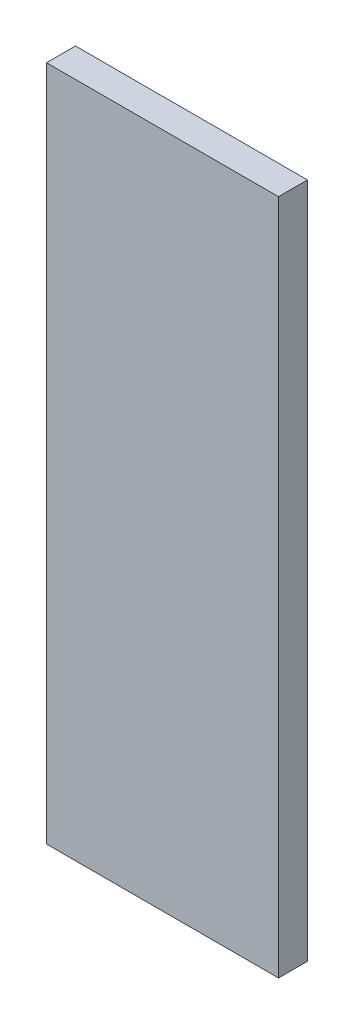
ISO-10303-21;
HEADER;
FILE_DESCRIPTION(('STEP AP214'),'2;1');
FILE_NAME('part.step','',(''),(''),'','','');
FILE_SCHEMA(('AUTOMOTIVE_DESIGN { 1 0 10303 214 1 1 1 1 }'));
ENDSEC;
DATA;
#1=APPLICATION_CONTEXT('core data for automotive mechanical design processes');
#2=APPLICATION_PROTOCOL_DEFINITION('international standard','automotive_design',2000,#1);
#3=PRODUCT_CONTEXT('',#1,'mechanical');
#4=PRODUCT('Part','Part','',(#3));
#5=PRODUCT_RELATED_PRODUCT_CATEGORY('part','',(#4));
#6=PRODUCT_DEFINITION_FORMATION('','',#4);
#7=PRODUCT_DEFINITION_CONTEXT('part definition',#1,'design');
#8=PRODUCT_DEFINITION('design','',#6,#7);
#9=PRODUCT_DEFINITION_SHAPE('','',#8);
#10=(LENGTH_UNIT() NAMED_UNIT(*) SI_UNIT(.MILLI.,.METRE.));
#11=(NAMED_UNIT(*) PLANE_ANGLE_UNIT() SI_UNIT($,.RADIAN.));
#12=(NAMED_UNIT(*) SI_UNIT($,.STERADIAN.) SOLID_ANGLE_UNIT());
#13=UNCERTAINTY_MEASURE_WITH_UNIT(LENGTH_MEASURE(1.E-05),#10,'distance_accuracy_value','');
#14=(GEOMETRIC_REPRESENTATION_CONTEXT(3) GLOBAL_UNCERTAINTY_ASSIGNED_CONTEXT((#13)) GLOBAL_UNIT_ASSIGNED_CONTEXT((#10,
#11,#12)) REPRESENTATION_CONTEXT('',''));
#15=CARTESIAN_POINT('',(0.,0.,0.));
#16=DIRECTION('',(0.,0.,1.));
#17=DIRECTION('',(1.,0.,0.));
#18=AXIS2_PLACEMENT_3D('',#15,#16,#17);
#19=CARTESIAN_POINT('',(12.,35.,3.));
#20=DIRECTION('',(-1.,0.,0.));
#21=DIRECTION('',(0.,-1.,0.));
#22=AXIS2_PLACEMENT_3D('',#19,#20,#21);
#23=PLANE('',#22);
#24=DIRECTION('',(0.,1.,0.));
#25=VECTOR('',#24,1.);
#26=CARTESIAN_POINT('',(12.,35.,0.));
#27=LINE('',#26,#25);
#28=CARTESIAN_POINT('',(12.,-35.,0.));
#29=VERTEX_POINT('',#28);
#30=CARTESIAN_POINT('',(12.,35.,0.));
#31=VERTEX_POINT('',#30);
#32=EDGE_CURVE('E108',#29,#31,#27,.T.);
#33=ORIENTED_EDGE('',*,*,#32,.T.);
#34=DIRECTION('',(0.,0.,-1.));
#35=VECTOR('',#34,1.);
#36=CARTESIAN_POINT('',(12.,35.,3.));
#37=LINE('',#36,#35);
#38=CARTESIAN_POINT('',(12.,35.,3.));
#39=VERTEX_POINT('',#38);
#40=EDGE_CURVE('E11',#39,#31,#37,.T.);
#41=ORIENTED_EDGE('',*,*,#40,.F.);
#42=DIRECTION('',(0.,1.,0.));
#43=VECTOR('',#42,1.);
#44=CARTESIAN_POINT('',(12.,35.,3.));
#45=LINE('',#44,#43);
#46=CARTESIAN_POINT('',(12.,-35.,3.));
#47=VERTEX_POINT('',#46);
#48=EDGE_CURVE('E96',#47,#39,#45,.T.);
#49=ORIENTED_EDGE('',*,*,#48,.F.);
#50=DIRECTION('',(0.,0.,-1.));
#51=VECTOR('',#50,1.);
#52=CARTESIAN_POINT('',(12.,-35.,3.));
#53=LINE('',#52,#51);
#54=EDGE_CURVE('E104',#47,#29,#53,.T.);
#55=ORIENTED_EDGE('',*,*,#54,.T.);
#56=EDGE_LOOP('',(#33,#41,#49,#55));
#57=FACE_BOUND('',#56,.T.);
#58=ADVANCED_FACE('F45',(#57),#23,.F.);
#59=CARTESIAN_POINT('',(-12.,35.,3.));
#60=DIRECTION('',(0.,-1.,0.));
#61=DIRECTION('',(0.,0.,-1.));
#62=AXIS2_PLACEMENT_3D('',#59,#60,#61);
#63=PLANE('',#62);
#64=DIRECTION('',(-1.,0.,0.));
#65=VECTOR('',#64,1.);
#66=CARTESIAN_POINT('',(-12.,35.,0.));
#67=LINE('',#66,#65);
#68=CARTESIAN_POINT('',(-12.,35.,0.));
#69=VERTEX_POINT('',#68);
#70=EDGE_CURVE('E100',#31,#69,#67,.T.);
#71=ORIENTED_EDGE('',*,*,#70,.T.);
#72=DIRECTION('',(0.,0.,-1.));
#73=VECTOR('',#72,1.);
#74=CARTESIAN_POINT('',(-12.,35.,3.));
#75=LINE('',#74,#73);
#76=CARTESIAN_POINT('',(-12.,35.,3.));
#77=VERTEX_POINT('',#76);
#78=EDGE_CURVE('E53',#77,#69,#75,.T.);
#79=ORIENTED_EDGE('',*,*,#78,.F.);
#80=DIRECTION('',(-1.,0.,0.));
#81=VECTOR('',#80,1.);
#82=CARTESIAN_POINT('',(-12.,35.,3.));
#83=LINE('',#82,#81);
#84=EDGE_CURVE('E91',#39,#77,#83,.T.);
#85=ORIENTED_EDGE('',*,*,#84,.F.);
#86=ORIENTED_EDGE('',*,*,#40,.T.);
#87=EDGE_LOOP('',(#71,#79,#85,#86));
#88=FACE_BOUND('',#87,.T.);
#89=ADVANCED_FACE('F99',(#88),#63,.F.);
#90=CARTESIAN_POINT('',(-12.,35.,3.));
#91=DIRECTION('',(1.,0.,0.));
#92=DIRECTION('',(0.,1.,0.));
#93=AXIS2_PLACEMENT_3D('',#90,#91,#92);
#94=PLANE('',#93);
#95=DIRECTION('',(0.,-1.,0.));
#96=VECTOR('',#95,1.);
#97=CARTESIAN_POINT('',(-12.,35.,0.));
#98=LINE('',#97,#96);
#99=CARTESIAN_POINT('',(-12.,-35.,0.));
#100=VERTEX_POINT('',#99);
#101=EDGE_CURVE('E78',#69,#100,#98,.T.);
#102=ORIENTED_EDGE('',*,*,#101,.T.);
#103=DIRECTION('',(0.,0.,-1.));
#104=VECTOR('',#103,1.);
#105=CARTESIAN_POINT('',(-12.,-35.,3.));
#106=LINE('',#105,#104);
#107=CARTESIAN_POINT('',(-12.,-35.,3.));
#108=VERTEX_POINT('',#107);
#109=EDGE_CURVE('E101',#108,#100,#106,.T.);
#110=ORIENTED_EDGE('',*,*,#109,.F.);
#111=DIRECTION('',(0.,-1.,0.));
#112=VECTOR('',#111,1.);
#113=CARTESIAN_POINT('',(-12.,35.,3.));
#114=LINE('',#113,#112);
#115=EDGE_CURVE('E94',#77,#108,#114,.T.);
#116=ORIENTED_EDGE('',*,*,#115,.F.);
#117=ORIENTED_EDGE('',*,*,#78,.T.);
#118=EDGE_LOOP('',(#102,#110,#116,#117));
#119=FACE_BOUND('',#118,.T.);
#120=ADVANCED_FACE('F102',(#119),#94,.F.);
#121=CARTESIAN_POINT('',(-12.,-35.,3.));
#122=DIRECTION('',(0.,1.,0.));
#123=DIRECTION('',(0.,0.,1.));
#124=AXIS2_PLACEMENT_3D('',#121,#122,#123);
#125=PLANE('',#124);
#126=DIRECTION('',(1.,0.,0.));
#127=VECTOR('',#126,1.);
#128=CARTESIAN_POINT('',(-12.,-35.,0.));
#129=LINE('',#128,#127);
#130=EDGE_CURVE('E84',#100,#29,#129,.T.);
#131=ORIENTED_EDGE('',*,*,#130,.T.);
#132=ORIENTED_EDGE('',*,*,#54,.F.);
#133=DIRECTION('',(1.,0.,0.));
#134=VECTOR('',#133,1.);
#135=CARTESIAN_POINT('',(-12.,-35.,3.));
#136=LINE('',#135,#134);
#137=EDGE_CURVE('E61',#108,#47,#136,.T.);
#138=ORIENTED_EDGE('',*,*,#137,.F.);
#139=ORIENTED_EDGE('',*,*,#109,.T.);
#140=EDGE_LOOP('',(#131,#132,#138,#139));
#141=FACE_BOUND('',#140,.T.);
#142=ADVANCED_FACE('F115',(#141),#125,.F.);
#143=CARTESIAN_POINT('',(0.,0.,3.));
#144=DIRECTION('',(0.,0.,1.));
#145=DIRECTION('',(1.,0.,0.));
#146=AXIS2_PLACEMENT_3D('',#143,#144,#145);
#147=PLANE('',#146);
#148=ORIENTED_EDGE('',*,*,#48,.T.);
#149=ORIENTED_EDGE('',*,*,#84,.T.);
#150=ORIENTED_EDGE('',*,*,#115,.T.);
#151=ORIENTED_EDGE('',*,*,#137,.T.);
#152=EDGE_LOOP('',(#148,#149,#150,#151));
#153=FACE_BOUND('',#152,.T.);
#154=ADVANCED_FACE('F92',(#153),#147,.T.);
#155=CARTESIAN_POINT('',(0.,0.,0.));
#156=DIRECTION('',(0.,0.,1.));
#157=DIRECTION('',(1.,0.,0.));
#158=AXIS2_PLACEMENT_3D('',#155,#156,#157);
#159=PLANE('',#158);
#160=ORIENTED_EDGE('',*,*,#32,.F.);
#161=ORIENTED_EDGE('',*,*,#130,.F.);
#162=ORIENTED_EDGE('',*,*,#101,.F.);
#163=ORIENTED_EDGE('',*,*,#70,.F.);
#164=EDGE_LOOP('',(#160,#161,#162,#163));
#165=FACE_BOUND('',#164,.T.);
#166=ADVANCED_FACE('F118',(#165),#159,.F.);
#167=CLOSED_SHELL('',(#58,#89,#120,#142,#154,#166));
#168=MANIFOLD_SOLID_BREP('B2',#167);
#169=ADVANCED_BREP_SHAPE_REPRESENTATION('',(#18,#168),#14);
#170=SHAPE_DEFINITION_REPRESENTATION(#9,#169);
ENDSEC;
END-ISO-10303-21;
